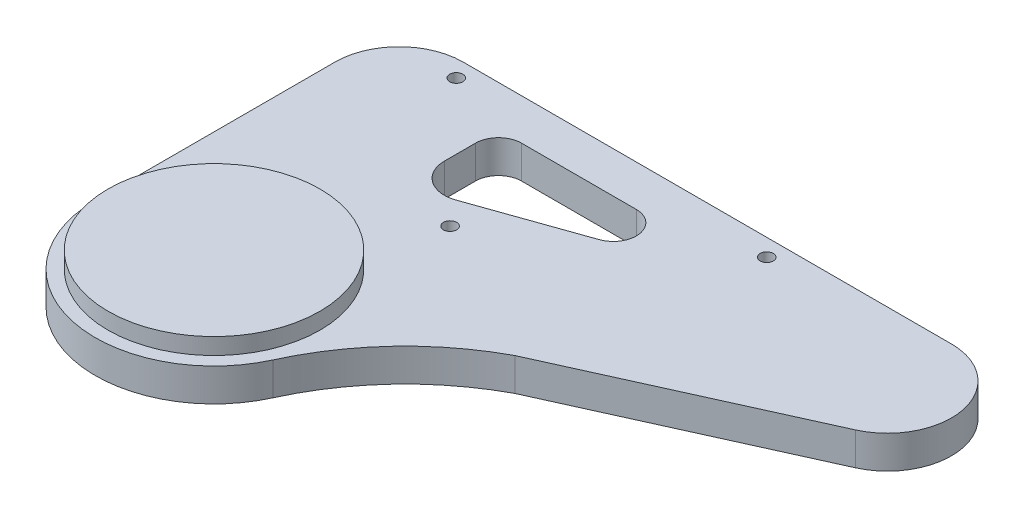
ISO-10303-21;
HEADER;
FILE_DESCRIPTION(('STEP AP214'),'2;1');
FILE_NAME('part.step','',(''),(''),'','','');
FILE_SCHEMA(('AUTOMOTIVE_DESIGN { 1 0 10303 214 1 1 1 1 }'));
ENDSEC;
DATA;
#1=APPLICATION_CONTEXT('core data for automotive mechanical design processes');
#2=APPLICATION_PROTOCOL_DEFINITION('international standard','automotive_design',2000,#1);
#3=PRODUCT_CONTEXT('',#1,'mechanical');
#4=PRODUCT('Part','Part','',(#3));
#5=PRODUCT_RELATED_PRODUCT_CATEGORY('part','',(#4));
#6=PRODUCT_DEFINITION_FORMATION('','',#4);
#7=PRODUCT_DEFINITION_CONTEXT('part definition',#1,'design');
#8=PRODUCT_DEFINITION('design','',#6,#7);
#9=PRODUCT_DEFINITION_SHAPE('','',#8);
#10=(LENGTH_UNIT() NAMED_UNIT(*) SI_UNIT(.MILLI.,.METRE.));
#11=(NAMED_UNIT(*) PLANE_ANGLE_UNIT() SI_UNIT($,.RADIAN.));
#12=(NAMED_UNIT(*) SI_UNIT($,.STERADIAN.) SOLID_ANGLE_UNIT());
#13=UNCERTAINTY_MEASURE_WITH_UNIT(LENGTH_MEASURE(1.E-05),#10,'distance_accuracy_value','');
#14=(GEOMETRIC_REPRESENTATION_CONTEXT(3) GLOBAL_UNCERTAINTY_ASSIGNED_CONTEXT((#13)) GLOBAL_UNIT_ASSIGNED_CONTEXT((#10,
#11,#12)) REPRESENTATION_CONTEXT('',''));
#15=CARTESIAN_POINT('',(0.,0.,0.));
#16=DIRECTION('',(0.,0.,1.));
#17=DIRECTION('',(1.,0.,0.));
#18=AXIS2_PLACEMENT_3D('',#15,#16,#17);
#19=CARTESIAN_POINT('',(-132.,-10.,73.));
#20=DIRECTION('',(0.,1.,0.));
#21=DIRECTION('',(0.,0.,1.));
#22=AXIS2_PLACEMENT_3D('',#19,#20,#21);
#23=CYLINDRICAL_SURFACE('',#22,36.1646516855807);
#24=CARTESIAN_POINT('',(-132.,0.,73.));
#25=DIRECTION('',(0.,1.,0.));
#26=DIRECTION('',(0.,0.,1.));
#27=AXIS2_PLACEMENT_3D('',#24,#25,#26);
#28=CIRCLE('',#27,36.1646516855807);
#29=CARTESIAN_POINT('',(-168.164651685581,0.,73.));
#30=VERTEX_POINT('',#29);
#31=CARTESIAN_POINT('',(-99.0921794209078,0.,87.9985791418272));
#32=VERTEX_POINT('',#31);
#33=EDGE_CURVE('E216',#30,#32,#28,.T.);
#34=ORIENTED_EDGE('',*,*,#33,.F.);
#35=DIRECTION('',(0.,1.,0.));
#36=VECTOR('',#35,1.);
#37=CARTESIAN_POINT('',(-168.164651685581,-10.,73.));
#38=LINE('',#37,#36);
#39=CARTESIAN_POINT('',(-168.164651685581,-10.,73.));
#40=VERTEX_POINT('',#39);
#41=EDGE_CURVE('E11',#40,#30,#38,.T.);
#42=ORIENTED_EDGE('',*,*,#41,.F.);
#43=CARTESIAN_POINT('',(-132.,-10.,73.));
#44=DIRECTION('',(0.,1.,0.));
#45=DIRECTION('',(0.,0.,1.));
#46=AXIS2_PLACEMENT_3D('',#43,#44,#45);
#47=CIRCLE('',#46,36.1646516855807);
#48=CARTESIAN_POINT('',(-99.0921794209078,-10.,87.9985791418272));
#49=VERTEX_POINT('',#48);
#50=EDGE_CURVE('E260',#40,#49,#47,.T.);
#51=ORIENTED_EDGE('',*,*,#50,.T.);
#52=DIRECTION('',(0.,1.,0.));
#53=VECTOR('',#52,1.);
#54=CARTESIAN_POINT('',(-99.0921794209078,-10.,87.9985791418272));
#55=LINE('',#54,#53);
#56=EDGE_CURVE('E170',#49,#32,#55,.T.);
#57=ORIENTED_EDGE('',*,*,#56,.T.);
#58=EDGE_LOOP('',(#34,#42,#51,#57));
#59=FACE_BOUND('',#58,.T.);
#60=ADVANCED_FACE('F38',(#59),#23,.T.);
#61=CARTESIAN_POINT('',(-168.164651685581,-10.,0.));
#62=DIRECTION('',(1.,0.,0.));
#63=DIRECTION('',(0.,0.,-1.));
#64=AXIS2_PLACEMENT_3D('',#61,#62,#63);
#65=PLANE('',#64);
#66=DIRECTION('',(0.,0.,-1.));
#67=VECTOR('',#66,1.);
#68=CARTESIAN_POINT('',(-168.164651685581,0.,0.));
#69=LINE('',#68,#67);
#70=CARTESIAN_POINT('',(-168.164651685581,0.,0.));
#71=VERTEX_POINT('',#70);
#72=EDGE_CURVE('E231',#30,#71,#69,.T.);
#73=ORIENTED_EDGE('',*,*,#72,.T.);
#74=DIRECTION('',(0.,1.,0.));
#75=VECTOR('',#74,1.);
#76=CARTESIAN_POINT('',(-168.164651685581,-10.,0.));
#77=LINE('',#76,#75);
#78=CARTESIAN_POINT('',(-168.164651685581,-10.,0.));
#79=VERTEX_POINT('',#78);
#80=EDGE_CURVE('E48',#79,#71,#77,.T.);
#81=ORIENTED_EDGE('',*,*,#80,.F.);
#82=DIRECTION('',(0.,0.,-1.));
#83=VECTOR('',#82,1.);
#84=CARTESIAN_POINT('',(-168.164651685581,-10.,0.));
#85=LINE('',#84,#83);
#86=EDGE_CURVE('E157',#40,#79,#85,.T.);
#87=ORIENTED_EDGE('',*,*,#86,.F.);
#88=ORIENTED_EDGE('',*,*,#41,.T.);
#89=EDGE_LOOP('',(#73,#81,#87,#88));
#90=FACE_BOUND('',#89,.T.);
#91=ADVANCED_FACE('F296',(#90),#65,.F.);
#92=CARTESIAN_POINT('',(-148.664651685581,-10.,0.));
#93=DIRECTION('',(0.,1.,0.));
#94=DIRECTION('',(0.,0.,1.));
#95=AXIS2_PLACEMENT_3D('',#92,#93,#94);
#96=CYLINDRICAL_SURFACE('',#95,19.5);
#97=CARTESIAN_POINT('',(-148.664651685581,0.,0.));
#98=DIRECTION('',(0.,1.,0.));
#99=DIRECTION('',(0.,0.,1.));
#100=AXIS2_PLACEMENT_3D('',#97,#98,#99);
#101=CIRCLE('',#100,19.5);
#102=CARTESIAN_POINT('',(-148.664651685581,0.,-19.5));
#103=VERTEX_POINT('',#102);
#104=EDGE_CURVE('E99',#71,#103,#101,.F.);
#105=ORIENTED_EDGE('',*,*,#104,.T.);
#106=DIRECTION('',(0.,1.,0.));
#107=VECTOR('',#106,1.);
#108=CARTESIAN_POINT('',(-148.664651685581,-10.,-19.5));
#109=LINE('',#108,#107);
#110=CARTESIAN_POINT('',(-148.664651685581,-10.,-19.5));
#111=VERTEX_POINT('',#110);
#112=EDGE_CURVE('E146',#111,#103,#109,.T.);
#113=ORIENTED_EDGE('',*,*,#112,.F.);
#114=CARTESIAN_POINT('',(-148.664651685581,-10.,0.));
#115=DIRECTION('',(0.,1.,0.));
#116=DIRECTION('',(0.,0.,1.));
#117=AXIS2_PLACEMENT_3D('',#114,#115,#116);
#118=CIRCLE('',#117,19.5);
#119=EDGE_CURVE('E151',#79,#111,#118,.F.);
#120=ORIENTED_EDGE('',*,*,#119,.F.);
#121=ORIENTED_EDGE('',*,*,#80,.T.);
#122=EDGE_LOOP('',(#105,#113,#120,#121));
#123=FACE_BOUND('',#122,.T.);
#124=ADVANCED_FACE('F161',(#123),#96,.T.);
#125=CARTESIAN_POINT('',(0.,-10.,-19.5));
#126=DIRECTION('',(0.,0.,1.));
#127=DIRECTION('',(1.,0.,0.));
#128=AXIS2_PLACEMENT_3D('',#125,#126,#127);
#129=PLANE('',#128);
#130=DIRECTION('',(1.,0.,0.));
#131=VECTOR('',#130,1.);
#132=CARTESIAN_POINT('',(0.,0.,-19.5));
#133=LINE('',#132,#131);
#134=CARTESIAN_POINT('',(0.235778669568407,0.,-19.5));
#135=VERTEX_POINT('',#134);
#136=EDGE_CURVE('E228',#103,#135,#133,.T.);
#137=ORIENTED_EDGE('',*,*,#136,.T.);
#138=DIRECTION('',(0.,1.,0.));
#139=VECTOR('',#138,1.);
#140=CARTESIAN_POINT('',(0.235778669568407,-10.,-19.5));
#141=LINE('',#140,#139);
#142=CARTESIAN_POINT('',(0.235778669568407,-10.,-19.5));
#143=VERTEX_POINT('',#142);
#144=EDGE_CURVE('E147',#143,#135,#141,.T.);
#145=ORIENTED_EDGE('',*,*,#144,.F.);
#146=DIRECTION('',(1.,0.,0.));
#147=VECTOR('',#146,1.);
#148=CARTESIAN_POINT('',(0.,-10.,-19.5));
#149=LINE('',#148,#147);
#150=EDGE_CURVE('E141',#111,#143,#149,.T.);
#151=ORIENTED_EDGE('',*,*,#150,.F.);
#152=ORIENTED_EDGE('',*,*,#112,.T.);
#153=EDGE_LOOP('',(#137,#145,#151,#152));
#154=FACE_BOUND('',#153,.T.);
#155=ADVANCED_FACE('F144',(#154),#129,.F.);
#156=CARTESIAN_POINT('',(0.,-10.,0.));
#157=DIRECTION('',(0.,1.,0.));
#158=DIRECTION('',(0.,0.,1.));
#159=AXIS2_PLACEMENT_3D('',#156,#157,#158);
#160=CYLINDRICAL_SURFACE('',#159,19.5014253730599);
#161=CARTESIAN_POINT('',(0.,0.,0.));
#162=DIRECTION('',(0.,1.,0.));
#163=DIRECTION('',(0.,0.,1.));
#164=AXIS2_PLACEMENT_3D('',#161,#162,#163);
#165=CIRCLE('',#164,19.5014253730599);
#166=CARTESIAN_POINT('',(8.01946044705156,0.,17.7762157311166));
#167=VERTEX_POINT('',#166);
#168=EDGE_CURVE('E225',#167,#135,#165,.T.);
#169=ORIENTED_EDGE('',*,*,#168,.F.);
#170=DIRECTION('',(0.,1.,0.));
#171=VECTOR('',#170,1.);
#172=CARTESIAN_POINT('',(8.01946044705156,-10.,17.7762157311166));
#173=LINE('',#172,#171);
#174=CARTESIAN_POINT('',(8.01946044705156,-10.,17.7762157311166));
#175=VERTEX_POINT('',#174);
#176=EDGE_CURVE('E164',#175,#167,#173,.T.);
#177=ORIENTED_EDGE('',*,*,#176,.F.);
#178=CARTESIAN_POINT('',(0.,-10.,0.));
#179=DIRECTION('',(0.,1.,0.));
#180=DIRECTION('',(0.,0.,1.));
#181=AXIS2_PLACEMENT_3D('',#178,#179,#180);
#182=CIRCLE('',#181,19.5014253730599);
#183=EDGE_CURVE('E152',#175,#143,#182,.T.);
#184=ORIENTED_EDGE('',*,*,#183,.T.);
#185=ORIENTED_EDGE('',*,*,#144,.T.);
#186=EDGE_LOOP('',(#169,#177,#184,#185));
#187=FACE_BOUND('',#186,.T.);
#188=ADVANCED_FACE('F270',(#187),#160,.T.);
#189=CARTESIAN_POINT('',(8.01946044705155,-10.,17.7762157311166));
#190=DIRECTION('',(0.411224323024613,0.,0.911534177172172));
#191=DIRECTION('',(0.911534177172172,0.,-0.411224323024613));
#192=AXIS2_PLACEMENT_3D('',#189,#190,#191);
#193=PLANE('',#192);
#194=DIRECTION('',(0.911534177172172,0.,-0.411224323024613));
#195=VECTOR('',#194,1.);
#196=CARTESIAN_POINT('',(8.01946044705155,0.,17.7762157311166));
#197=LINE('',#196,#195);
#198=CARTESIAN_POINT('',(-63.4089036702921,0.,50.));
#199=VERTEX_POINT('',#198);
#200=EDGE_CURVE('E222',#199,#167,#197,.T.);
#201=ORIENTED_EDGE('',*,*,#200,.F.);
#202=DIRECTION('',(0.,1.,0.));
#203=VECTOR('',#202,1.);
#204=CARTESIAN_POINT('',(-63.4089036702921,-10.,50.));
#205=LINE('',#204,#203);
#206=CARTESIAN_POINT('',(-63.4089036702921,-10.,50.));
#207=VERTEX_POINT('',#206);
#208=EDGE_CURVE('E168',#207,#199,#205,.T.);
#209=ORIENTED_EDGE('',*,*,#208,.F.);
#210=DIRECTION('',(0.911534177172172,0.,-0.411224323024613));
#211=VECTOR('',#210,1.);
#212=CARTESIAN_POINT('',(8.01946044705155,-10.,17.7762157311166));
#213=LINE('',#212,#211);
#214=EDGE_CURVE('E265',#207,#175,#213,.T.);
#215=ORIENTED_EDGE('',*,*,#214,.T.);
#216=ORIENTED_EDGE('',*,*,#176,.T.);
#217=EDGE_LOOP('',(#201,#209,#215,#216));
#218=FACE_BOUND('',#217,.T.);
#219=ADVANCED_FACE('F275',(#218),#193,.T.);
#220=CARTESIAN_POINT('',(-83.45,-10.,-0.000679644586493514));
#221=DIRECTION('',(0.,1.,0.));
#222=DIRECTION('',(0.,0.,1.));
#223=AXIS2_PLACEMENT_3D('',#220,#221,#222);
#224=CYLINDRICAL_SURFACE('',#223,7.);
#225=CARTESIAN_POINT('',(-83.45,0.,-0.000679644586493514));
#226=DIRECTION('',(0.,1.,0.));
#227=DIRECTION('',(0.,0.,1.));
#228=AXIS2_PLACEMENT_3D('',#225,#226,#227);
#229=CIRCLE('',#228,7.);
#230=CARTESIAN_POINT('',(-81.1216810435513,0.,6.60075435395062));
#231=VERTEX_POINT('',#230);
#232=CARTESIAN_POINT('',(-83.3524573821638,0.,-6.99999999999999));
#233=VERTEX_POINT('',#232);
#234=EDGE_CURVE('E202',#231,#233,#229,.T.);
#235=ORIENTED_EDGE('',*,*,#234,.T.);
#236=DIRECTION('',(0.,1.,0.));
#237=VECTOR('',#236,1.);
#238=CARTESIAN_POINT('',(-83.3524573821638,-10.,-6.99999999999999));
#239=LINE('',#238,#237);
#240=CARTESIAN_POINT('',(-83.3524573821638,-10.,-6.99999999999999));
#241=VERTEX_POINT('',#240);
#242=EDGE_CURVE('E172',#241,#233,#239,.T.);
#243=ORIENTED_EDGE('',*,*,#242,.F.);
#244=CARTESIAN_POINT('',(-83.45,-10.,-0.000679644586493514));
#245=DIRECTION('',(0.,1.,0.));
#246=DIRECTION('',(0.,0.,1.));
#247=AXIS2_PLACEMENT_3D('',#244,#245,#246);
#248=CIRCLE('',#247,7.);
#249=CARTESIAN_POINT('',(-81.1216810435513,-10.,6.60075435395062));
#250=VERTEX_POINT('',#249);
#251=EDGE_CURVE('E247',#250,#241,#248,.T.);
#252=ORIENTED_EDGE('',*,*,#251,.F.);
#253=DIRECTION('',(0.,1.,0.));
#254=VECTOR('',#253,1.);
#255=CARTESIAN_POINT('',(-81.1216810435513,-10.,6.60075435395062));
#256=LINE('',#255,#254);
#257=EDGE_CURVE('E42',#250,#231,#256,.T.);
#258=ORIENTED_EDGE('',*,*,#257,.T.);
#259=EDGE_LOOP('',(#235,#243,#252,#258));
#260=FACE_BOUND('',#259,.T.);
#261=ADVANCED_FACE('F308',(#260),#224,.F.);
#262=CARTESIAN_POINT('',(0.,-10.,-6.99999999999999));
#263=DIRECTION('',(0.,0.,1.));
#264=DIRECTION('',(1.,0.,0.));
#265=AXIS2_PLACEMENT_3D('',#262,#263,#264);
#266=PLANE('',#265);
#267=DIRECTION('',(1.,0.,0.));
#268=VECTOR('',#267,1.);
#269=CARTESIAN_POINT('',(0.,0.,-6.99999999999999));
#270=LINE('',#269,#268);
#271=CARTESIAN_POINT('',(-118.4,0.,-6.99999999999999));
#272=VERTEX_POINT('',#271);
#273=EDGE_CURVE('E213',#272,#233,#270,.T.);
#274=ORIENTED_EDGE('',*,*,#273,.F.);
#275=DIRECTION('',(0.,1.,0.));
#276=VECTOR('',#275,1.);
#277=CARTESIAN_POINT('',(-118.4,-10.,-6.99999999999999));
#278=LINE('',#277,#276);
#279=CARTESIAN_POINT('',(-118.4,-10.,-6.99999999999999));
#280=VERTEX_POINT('',#279);
#281=EDGE_CURVE('E174',#280,#272,#278,.T.);
#282=ORIENTED_EDGE('',*,*,#281,.F.);
#283=DIRECTION('',(1.,0.,0.));
#284=VECTOR('',#283,1.);
#285=CARTESIAN_POINT('',(0.,-10.,-6.99999999999999));
#286=LINE('',#285,#284);
#287=EDGE_CURVE('E257',#280,#241,#286,.T.);
#288=ORIENTED_EDGE('',*,*,#287,.T.);
#289=ORIENTED_EDGE('',*,*,#242,.T.);
#290=EDGE_LOOP('',(#274,#282,#288,#289));
#291=FACE_BOUND('',#290,.T.);
#292=ADVANCED_FACE('F304',(#291),#266,.T.);
#293=CARTESIAN_POINT('',(-118.4,-10.,0.));
#294=DIRECTION('',(0.,1.,0.));
#295=DIRECTION('',(0.,0.,1.));
#296=AXIS2_PLACEMENT_3D('',#293,#294,#295);
#297=CYLINDRICAL_SURFACE('',#296,7.);
#298=CARTESIAN_POINT('',(-118.4,0.,0.));
#299=DIRECTION('',(0.,1.,0.));
#300=DIRECTION('',(0.,0.,1.));
#301=AXIS2_PLACEMENT_3D('',#298,#299,#300);
#302=CIRCLE('',#301,7.);
#303=CARTESIAN_POINT('',(-125.4,0.,0.));
#304=VERTEX_POINT('',#303);
#305=EDGE_CURVE('E210',#304,#272,#302,.F.);
#306=ORIENTED_EDGE('',*,*,#305,.F.);
#307=DIRECTION('',(0.,1.,0.));
#308=VECTOR('',#307,1.);
#309=CARTESIAN_POINT('',(-125.4,-10.,0.));
#310=LINE('',#309,#308);
#311=CARTESIAN_POINT('',(-125.4,-10.,0.));
#312=VERTEX_POINT('',#311);
#313=EDGE_CURVE('E176',#312,#304,#310,.T.);
#314=ORIENTED_EDGE('',*,*,#313,.F.);
#315=CARTESIAN_POINT('',(-118.4,-10.,0.));
#316=DIRECTION('',(0.,1.,0.));
#317=DIRECTION('',(0.,0.,1.));
#318=AXIS2_PLACEMENT_3D('',#315,#316,#317);
#319=CIRCLE('',#318,7.);
#320=EDGE_CURVE('E254',#312,#280,#319,.F.);
#321=ORIENTED_EDGE('',*,*,#320,.T.);
#322=ORIENTED_EDGE('',*,*,#281,.T.);
#323=EDGE_LOOP('',(#306,#314,#321,#322));
#324=FACE_BOUND('',#323,.T.);
#325=ADVANCED_FACE('F307',(#324),#297,.F.);
#326=CARTESIAN_POINT('',(-125.4,-10.,0.));
#327=DIRECTION('',(-1.,0.,0.));
#328=DIRECTION('',(0.,0.,1.));
#329=AXIS2_PLACEMENT_3D('',#326,#327,#328);
#330=PLANE('',#329);
#331=DIRECTION('',(0.,0.,1.));
#332=VECTOR('',#331,1.);
#333=CARTESIAN_POINT('',(-125.4,0.,0.));
#334=LINE('',#333,#332);
#335=CARTESIAN_POINT('',(-125.4,0.,9.50000000000001));
#336=VERTEX_POINT('',#335);
#337=EDGE_CURVE('E208',#304,#336,#334,.T.);
#338=ORIENTED_EDGE('',*,*,#337,.T.);
#339=DIRECTION('',(0.,1.,0.));
#340=VECTOR('',#339,1.);
#341=CARTESIAN_POINT('',(-125.4,-10.,9.50000000000001));
#342=LINE('',#341,#340);
#343=CARTESIAN_POINT('',(-125.4,-10.,9.50000000000001));
#344=VERTEX_POINT('',#343);
#345=EDGE_CURVE('E178',#344,#336,#342,.T.);
#346=ORIENTED_EDGE('',*,*,#345,.F.);
#347=DIRECTION('',(0.,0.,1.));
#348=VECTOR('',#347,1.);
#349=CARTESIAN_POINT('',(-125.4,-10.,0.));
#350=LINE('',#349,#348);
#351=EDGE_CURVE('E252',#312,#344,#350,.T.);
#352=ORIENTED_EDGE('',*,*,#351,.F.);
#353=ORIENTED_EDGE('',*,*,#313,.T.);
#354=EDGE_LOOP('',(#338,#346,#352,#353));
#355=FACE_BOUND('',#354,.T.);
#356=ADVANCED_FACE('F312',(#355),#330,.F.);
#357=CARTESIAN_POINT('',(-116.4,-10.,9.50000000000001));
#358=DIRECTION('',(0.,1.,0.));
#359=DIRECTION('',(0.,0.,1.));
#360=AXIS2_PLACEMENT_3D('',#357,#358,#359);
#361=CYLINDRICAL_SURFACE('',#360,9.00000000000001);
#362=CARTESIAN_POINT('',(-116.4,0.,9.50000000000001));
#363=DIRECTION('',(0.,1.,0.));
#364=DIRECTION('',(0.,0.,1.));
#365=AXIS2_PLACEMENT_3D('',#362,#363,#364);
#366=CIRCLE('',#365,9.00000000000001);
#367=CARTESIAN_POINT('',(-113.406447055995,0.,17.9875579981192));
#368=VERTEX_POINT('',#367);
#369=EDGE_CURVE('E206',#336,#368,#366,.T.);
#370=ORIENTED_EDGE('',*,*,#369,.T.);
#371=DIRECTION('',(0.,1.,0.));
#372=VECTOR('',#371,1.);
#373=CARTESIAN_POINT('',(-113.406447055995,-10.,17.9875579981192));
#374=LINE('',#373,#372);
#375=CARTESIAN_POINT('',(-113.406447055995,-10.,17.9875579981192));
#376=VERTEX_POINT('',#375);
#377=EDGE_CURVE('E180',#376,#368,#374,.T.);
#378=ORIENTED_EDGE('',*,*,#377,.F.);
#379=CARTESIAN_POINT('',(-116.4,-10.,9.50000000000001));
#380=DIRECTION('',(0.,1.,0.));
#381=DIRECTION('',(0.,0.,1.));
#382=AXIS2_PLACEMENT_3D('',#379,#380,#381);
#383=CIRCLE('',#382,9.00000000000001);
#384=EDGE_CURVE('E250',#344,#376,#383,.T.);
#385=ORIENTED_EDGE('',*,*,#384,.F.);
#386=ORIENTED_EDGE('',*,*,#345,.T.);
#387=EDGE_LOOP('',(#370,#378,#385,#386));
#388=FACE_BOUND('',#387,.T.);
#389=ADVANCED_FACE('F316',(#388),#361,.F.);
#390=CARTESIAN_POINT('',(-6.90430692012131,-10.,-19.5756368828195));
#391=DIRECTION('',(0.332616993778378,0.,0.943061999791018));
#392=DIRECTION('',(0.943061999791018,0.,-0.332616993778378));
#393=AXIS2_PLACEMENT_3D('',#390,#391,#392);
#394=PLANE('',#393);
#395=DIRECTION('',(0.943061999791018,0.,-0.332616993778378));
#396=VECTOR('',#395,1.);
#397=CARTESIAN_POINT('',(-6.90430692012131,0.,-19.5756368828195));
#398=LINE('',#397,#396);
#399=EDGE_CURVE('E204',#368,#231,#398,.T.);
#400=ORIENTED_EDGE('',*,*,#399,.T.);
#401=ORIENTED_EDGE('',*,*,#257,.F.);
#402=DIRECTION('',(0.943061999791018,0.,-0.332616993778378));
#403=VECTOR('',#402,1.);
#404=CARTESIAN_POINT('',(-6.90430692012131,-10.,-19.5756368828195));
#405=LINE('',#404,#403);
#406=EDGE_CURVE('E111',#376,#250,#405,.T.);
#407=ORIENTED_EDGE('',*,*,#406,.F.);
#408=ORIENTED_EDGE('',*,*,#377,.T.);
#409=EDGE_LOOP('',(#400,#401,#407,#408));
#410=FACE_BOUND('',#409,.T.);
#411=ADVANCED_FACE('F320',(#410),#394,.F.);
#412=CARTESIAN_POINT('',(-51.0032974951872,-10.,-14.25));
#413=DIRECTION('',(0.,1.,0.));
#414=DIRECTION('',(0.,0.,1.));
#415=AXIS2_PLACEMENT_3D('',#412,#413,#414);
#416=CYLINDRICAL_SURFACE('',#415,2.);
#417=CARTESIAN_POINT('',(-51.0032974951872,-10.,-14.25));
#418=DIRECTION('',(0.,1.,0.));
#419=DIRECTION('',(0.,0.,1.));
#420=AXIS2_PLACEMENT_3D('',#417,#418,#419);
#421=CIRCLE('',#420,2.);
#422=CARTESIAN_POINT('',(-51.0032974951872,-10.,-12.25));
#423=VERTEX_POINT('',#422);
#424=EDGE_CURVE('E239',#423,#423,#421,.T.);
#425=ORIENTED_EDGE('',*,*,#424,.F.);
#426=EDGE_LOOP('',(#425));
#427=FACE_BOUND('',#426,.T.);
#428=CARTESIAN_POINT('',(-51.0032974951872,0.,-14.25));
#429=DIRECTION('',(0.,1.,0.));
#430=DIRECTION('',(0.,0.,1.));
#431=AXIS2_PLACEMENT_3D('',#428,#429,#430);
#432=CIRCLE('',#431,2.);
#433=CARTESIAN_POINT('',(-51.0032974951872,0.,-12.25));
#434=VERTEX_POINT('',#433);
#435=EDGE_CURVE('E199',#434,#434,#432,.T.);
#436=ORIENTED_EDGE('',*,*,#435,.T.);
#437=EDGE_LOOP('',(#436));
#438=FACE_BOUND('',#437,.T.);
#439=ADVANCED_FACE('F324',(#427,#438),#416,.F.);
#440=CARTESIAN_POINT('',(-107.4,-10.,25.75));
#441=DIRECTION('',(0.,1.,0.));
#442=DIRECTION('',(0.,0.,1.));
#443=AXIS2_PLACEMENT_3D('',#440,#441,#442);
#444=CYLINDRICAL_SURFACE('',#443,2.);
#445=CARTESIAN_POINT('',(-107.4,-10.,25.75));
#446=DIRECTION('',(0.,1.,0.));
#447=DIRECTION('',(0.,0.,1.));
#448=AXIS2_PLACEMENT_3D('',#445,#446,#447);
#449=CIRCLE('',#448,2.);
#450=CARTESIAN_POINT('',(-107.4,-10.,27.75));
#451=VERTEX_POINT('',#450);
#452=EDGE_CURVE('E234',#451,#451,#449,.T.);
#453=ORIENTED_EDGE('',*,*,#452,.F.);
#454=EDGE_LOOP('',(#453));
#455=FACE_BOUND('',#454,.T.);
#456=CARTESIAN_POINT('',(-107.4,0.,25.75));
#457=DIRECTION('',(0.,1.,0.));
#458=DIRECTION('',(0.,0.,1.));
#459=AXIS2_PLACEMENT_3D('',#456,#457,#458);
#460=CIRCLE('',#459,2.);
#461=CARTESIAN_POINT('',(-107.4,0.,27.75));
#462=VERTEX_POINT('',#461);
#463=EDGE_CURVE('E195',#462,#462,#460,.T.);
#464=ORIENTED_EDGE('',*,*,#463,.T.);
#465=EDGE_LOOP('',(#464));
#466=FACE_BOUND('',#465,.T.);
#467=ADVANCED_FACE('F328',(#455,#466),#444,.F.);
#468=CARTESIAN_POINT('',(-145.503297495187,-10.,-14.25));
#469=DIRECTION('',(0.,1.,0.));
#470=DIRECTION('',(0.,0.,1.));
#471=AXIS2_PLACEMENT_3D('',#468,#469,#470);
#472=CYLINDRICAL_SURFACE('',#471,2.);
#473=CARTESIAN_POINT('',(-145.503297495187,-10.,-14.25));
#474=DIRECTION('',(0.,1.,0.));
#475=DIRECTION('',(0.,0.,1.));
#476=AXIS2_PLACEMENT_3D('',#473,#474,#475);
#477=CIRCLE('',#476,2.);
#478=CARTESIAN_POINT('',(-145.503297495187,-10.,-12.25));
#479=VERTEX_POINT('',#478);
#480=EDGE_CURVE('E232',#479,#479,#477,.T.);
#481=ORIENTED_EDGE('',*,*,#480,.F.);
#482=EDGE_LOOP('',(#481));
#483=FACE_BOUND('',#482,.T.);
#484=CARTESIAN_POINT('',(-145.503297495187,0.,-14.25));
#485=DIRECTION('',(0.,1.,0.));
#486=DIRECTION('',(0.,0.,1.));
#487=AXIS2_PLACEMENT_3D('',#484,#485,#486);
#488=CIRCLE('',#487,2.);
#489=CARTESIAN_POINT('',(-145.503297495187,0.,-12.25));
#490=VERTEX_POINT('',#489);
#491=EDGE_CURVE('E192',#490,#490,#488,.T.);
#492=ORIENTED_EDGE('',*,*,#491,.T.);
#493=EDGE_LOOP('',(#492));
#494=FACE_BOUND('',#493,.T.);
#495=ADVANCED_FACE('F40',(#483,#494),#472,.F.);
#496=CARTESIAN_POINT('',(-25.1126245485608,-10.,121.716649469918));
#497=DIRECTION('',(0.,1.,0.));
#498=DIRECTION('',(0.,0.,1.));
#499=AXIS2_PLACEMENT_3D('',#496,#497,#498);
#500=CYLINDRICAL_SURFACE('',#499,81.3011857586388);
#501=CARTESIAN_POINT('',(-25.1126245485608,0.,121.716649469918));
#502=DIRECTION('',(0.,1.,0.));
#503=DIRECTION('',(0.,0.,1.));
#504=AXIS2_PLACEMENT_3D('',#501,#502,#503);
#505=CIRCLE('',#504,81.3011857586388);
#506=EDGE_CURVE('E219',#32,#199,#505,.F.);
#507=ORIENTED_EDGE('',*,*,#506,.F.);
#508=ORIENTED_EDGE('',*,*,#56,.F.);
#509=CARTESIAN_POINT('',(-25.1126245485608,-10.,121.716649469918));
#510=DIRECTION('',(0.,1.,0.));
#511=DIRECTION('',(0.,0.,1.));
#512=AXIS2_PLACEMENT_3D('',#509,#510,#511);
#513=CIRCLE('',#512,81.3011857586388);
#514=EDGE_CURVE('E262',#49,#207,#513,.F.);
#515=ORIENTED_EDGE('',*,*,#514,.T.);
#516=ORIENTED_EDGE('',*,*,#208,.T.);
#517=EDGE_LOOP('',(#507,#508,#515,#516));
#518=FACE_BOUND('',#517,.T.);
#519=ADVANCED_FACE('F278',(#518),#500,.F.);
#520=CARTESIAN_POINT('',(0.,-10.,0.));
#521=DIRECTION('',(0.,1.,0.));
#522=DIRECTION('',(0.,0.,1.));
#523=AXIS2_PLACEMENT_3D('',#520,#521,#522);
#524=PLANE('',#523);
#525=ORIENTED_EDGE('',*,*,#480,.T.);
#526=EDGE_LOOP('',(#525));
#527=FACE_BOUND('',#526,.T.);
#528=ORIENTED_EDGE('',*,*,#452,.T.);
#529=EDGE_LOOP('',(#528));
#530=FACE_BOUND('',#529,.T.);
#531=ORIENTED_EDGE('',*,*,#424,.T.);
#532=EDGE_LOOP('',(#531));
#533=FACE_BOUND('',#532,.T.);
#534=ORIENTED_EDGE('',*,*,#251,.T.);
#535=ORIENTED_EDGE('',*,*,#287,.F.);
#536=ORIENTED_EDGE('',*,*,#320,.F.);
#537=ORIENTED_EDGE('',*,*,#351,.T.);
#538=ORIENTED_EDGE('',*,*,#384,.T.);
#539=ORIENTED_EDGE('',*,*,#406,.T.);
#540=EDGE_LOOP('',(#534,#535,#536,#537,#538,#539));
#541=FACE_BOUND('',#540,.T.);
#542=ORIENTED_EDGE('',*,*,#50,.F.);
#543=ORIENTED_EDGE('',*,*,#86,.T.);
#544=ORIENTED_EDGE('',*,*,#119,.T.);
#545=ORIENTED_EDGE('',*,*,#150,.T.);
#546=ORIENTED_EDGE('',*,*,#183,.F.);
#547=ORIENTED_EDGE('',*,*,#214,.F.);
#548=ORIENTED_EDGE('',*,*,#514,.F.);
#549=EDGE_LOOP('',(#542,#543,#544,#545,#546,#547,#548));
#550=FACE_BOUND('',#549,.T.);
#551=ADVANCED_FACE('F156',(#527,#530,#533,#541,#550),#524,.F.);
#552=CARTESIAN_POINT('',(0.,0.,0.));
#553=DIRECTION('',(0.,1.,0.));
#554=DIRECTION('',(0.,0.,1.));
#555=AXIS2_PLACEMENT_3D('',#552,#553,#554);
#556=PLANE('',#555);
#557=CARTESIAN_POINT('',(-132.,0.,73.));
#558=DIRECTION('',(0.,1.,0.));
#559=DIRECTION('',(0.,0.,1.));
#560=AXIS2_PLACEMENT_3D('',#557,#558,#559);
#561=CIRCLE('',#560,32.25);
#562=CARTESIAN_POINT('',(-132.,0.,105.25));
#563=VERTEX_POINT('',#562);
#564=EDGE_CURVE('E242',#563,#563,#561,.T.);
#565=ORIENTED_EDGE('',*,*,#564,.F.);
#566=EDGE_LOOP('',(#565));
#567=FACE_BOUND('',#566,.T.);
#568=ORIENTED_EDGE('',*,*,#491,.F.);
#569=EDGE_LOOP('',(#568));
#570=FACE_BOUND('',#569,.T.);
#571=ORIENTED_EDGE('',*,*,#463,.F.);
#572=EDGE_LOOP('',(#571));
#573=FACE_BOUND('',#572,.T.);
#574=ORIENTED_EDGE('',*,*,#435,.F.);
#575=EDGE_LOOP('',(#574));
#576=FACE_BOUND('',#575,.T.);
#577=ORIENTED_EDGE('',*,*,#234,.F.);
#578=ORIENTED_EDGE('',*,*,#399,.F.);
#579=ORIENTED_EDGE('',*,*,#369,.F.);
#580=ORIENTED_EDGE('',*,*,#337,.F.);
#581=ORIENTED_EDGE('',*,*,#305,.T.);
#582=ORIENTED_EDGE('',*,*,#273,.T.);
#583=EDGE_LOOP('',(#577,#578,#579,#580,#581,#582));
#584=FACE_BOUND('',#583,.T.);
#585=ORIENTED_EDGE('',*,*,#33,.T.);
#586=ORIENTED_EDGE('',*,*,#506,.T.);
#587=ORIENTED_EDGE('',*,*,#200,.T.);
#588=ORIENTED_EDGE('',*,*,#168,.T.);
#589=ORIENTED_EDGE('',*,*,#136,.F.);
#590=ORIENTED_EDGE('',*,*,#104,.F.);
#591=ORIENTED_EDGE('',*,*,#72,.F.);
#592=EDGE_LOOP('',(#585,#586,#587,#588,#589,#590,#591));
#593=FACE_BOUND('',#592,.T.);
#594=ADVANCED_FACE('F279',(#567,#570,#573,#576,#584,#593),#556,.T.);
#595=CARTESIAN_POINT('',(-132.,5.,73.));
#596=DIRECTION('',(0.,-1.,0.));
#597=DIRECTION('',(0.,0.,-1.));
#598=AXIS2_PLACEMENT_3D('',#595,#596,#597);
#599=CYLINDRICAL_SURFACE('',#598,32.25);
#600=CARTESIAN_POINT('',(-132.,5.,73.));
#601=DIRECTION('',(0.,1.,0.));
#602=DIRECTION('',(0.,0.,1.));
#603=AXIS2_PLACEMENT_3D('',#600,#601,#602);
#604=CIRCLE('',#603,32.25);
#605=CARTESIAN_POINT('',(-132.,5.,105.25));
#606=VERTEX_POINT('',#605);
#607=EDGE_CURVE('E196',#606,#606,#604,.T.);
#608=ORIENTED_EDGE('',*,*,#607,.F.);
#609=EDGE_LOOP('',(#608));
#610=FACE_BOUND('',#609,.T.);
#611=ORIENTED_EDGE('',*,*,#564,.T.);
#612=EDGE_LOOP('',(#611));
#613=FACE_BOUND('',#612,.T.);
#614=ADVANCED_FACE('F281',(#610,#613),#599,.T.);
#615=CARTESIAN_POINT('',(0.,5.,0.));
#616=DIRECTION('',(0.,1.,0.));
#617=DIRECTION('',(0.,0.,1.));
#618=AXIS2_PLACEMENT_3D('',#615,#616,#617);
#619=PLANE('',#618);
#620=ORIENTED_EDGE('',*,*,#607,.T.);
#621=EDGE_LOOP('',(#620));
#622=FACE_BOUND('',#621,.T.);
#623=ADVANCED_FACE('F288',(#622),#619,.T.);
#624=CLOSED_SHELL('',(#60,#91,#124,#155,#188,#219,#261,#292,#325,#356,#389,#411,#439,#467,#495,
#519,#551,#594,#614,#623));
#625=MANIFOLD_SOLID_BREP('B2',#624);
#626=ADVANCED_BREP_SHAPE_REPRESENTATION('',(#18,#625),#14);
#627=SHAPE_DEFINITION_REPRESENTATION(#9,#626);
ENDSEC;
END-ISO-10303-21;
